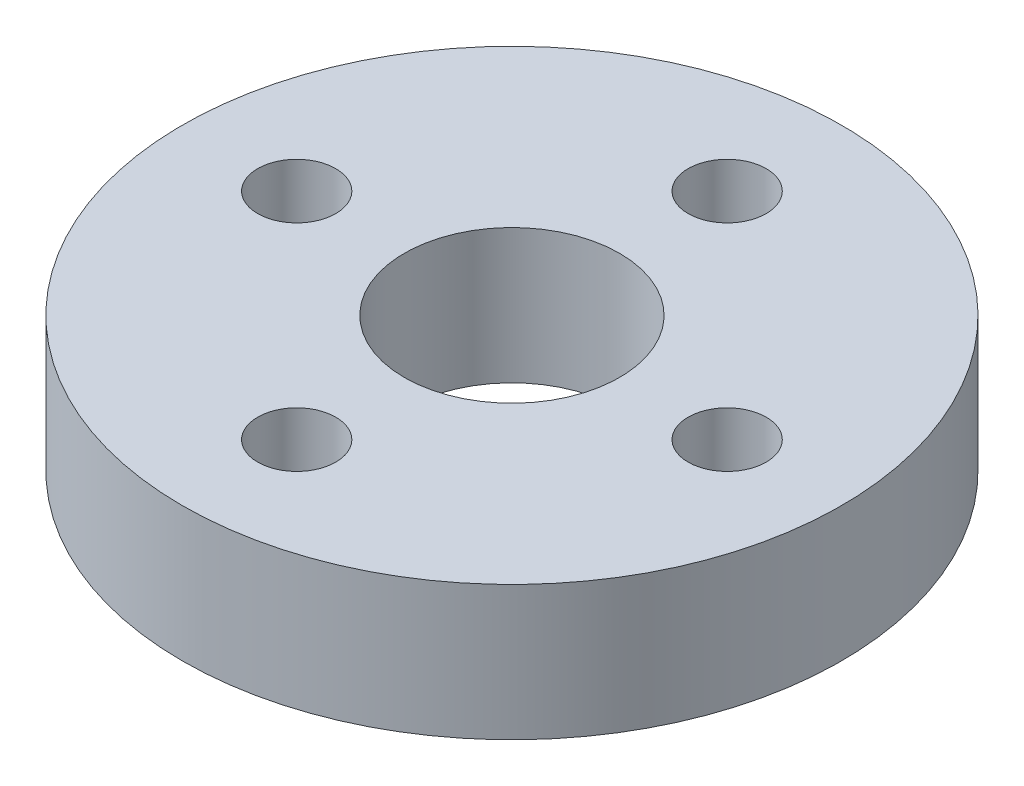
ISO-10303-21;
HEADER;
FILE_DESCRIPTION(('STEP AP214'),'2;1');
FILE_NAME('part.step','',(''),(''),'','','');
FILE_SCHEMA(('AUTOMOTIVE_DESIGN { 1 0 10303 214 1 1 1 1 }'));
ENDSEC;
DATA;
#1=APPLICATION_CONTEXT('core data for automotive mechanical design processes');
#2=APPLICATION_PROTOCOL_DEFINITION('international standard','automotive_design',2000,#1);
#3=PRODUCT_CONTEXT('',#1,'mechanical');
#4=PRODUCT('Part','Part','',(#3));
#5=PRODUCT_RELATED_PRODUCT_CATEGORY('part','',(#4));
#6=PRODUCT_DEFINITION_FORMATION('','',#4);
#7=PRODUCT_DEFINITION_CONTEXT('part definition',#1,'design');
#8=PRODUCT_DEFINITION('design','',#6,#7);
#9=PRODUCT_DEFINITION_SHAPE('','',#8);
#10=(LENGTH_UNIT() NAMED_UNIT(*) SI_UNIT(.MILLI.,.METRE.));
#11=(NAMED_UNIT(*) PLANE_ANGLE_UNIT() SI_UNIT($,.RADIAN.));
#12=(NAMED_UNIT(*) SI_UNIT($,.STERADIAN.) SOLID_ANGLE_UNIT());
#13=UNCERTAINTY_MEASURE_WITH_UNIT(LENGTH_MEASURE(1.E-05),#10,'distance_accuracy_value','');
#14=(GEOMETRIC_REPRESENTATION_CONTEXT(3) GLOBAL_UNCERTAINTY_ASSIGNED_CONTEXT((#13)) GLOBAL_UNIT_ASSIGNED_CONTEXT((#10,
#11,#12)) REPRESENTATION_CONTEXT('',''));
#15=CARTESIAN_POINT('',(0.,0.,0.));
#16=DIRECTION('',(0.,0.,1.));
#17=DIRECTION('',(1.,0.,0.));
#18=AXIS2_PLACEMENT_3D('',#15,#16,#17);
#19=CARTESIAN_POINT('',(0.,5.,0.));
#20=DIRECTION('',(0.,1.,0.));
#21=DIRECTION('',(0.,0.,1.));
#22=AXIS2_PLACEMENT_3D('',#19,#20,#21);
#23=PLANE('',#22);
#24=CARTESIAN_POINT('',(0.,5.,8.));
#25=DIRECTION('',(0.,1.,0.));
#26=DIRECTION('',(0.,0.,1.));
#27=AXIS2_PLACEMENT_3D('',#24,#25,#26);
#28=CIRCLE('',#27,1.45);
#29=CARTESIAN_POINT('',(0.,5.,9.45));
#30=VERTEX_POINT('',#29);
#31=EDGE_CURVE('E61',#30,#30,#28,.T.);
#32=ORIENTED_EDGE('',*,*,#31,.F.);
#33=EDGE_LOOP('',(#32));
#34=FACE_BOUND('',#33,.T.);
#35=CARTESIAN_POINT('',(0.,5.,-8.));
#36=DIRECTION('',(0.,1.,0.));
#37=DIRECTION('',(0.,0.,1.));
#38=AXIS2_PLACEMENT_3D('',#35,#36,#37);
#39=CIRCLE('',#38,1.45);
#40=CARTESIAN_POINT('',(0.,5.,-6.55));
#41=VERTEX_POINT('',#40);
#42=EDGE_CURVE('E49',#41,#41,#39,.T.);
#43=ORIENTED_EDGE('',*,*,#42,.F.);
#44=EDGE_LOOP('',(#43));
#45=FACE_BOUND('',#44,.T.);
#46=CARTESIAN_POINT('',(0.,5.,0.));
#47=DIRECTION('',(0.,1.,0.));
#48=DIRECTION('',(0.,0.,1.));
#49=AXIS2_PLACEMENT_3D('',#46,#47,#48);
#50=CIRCLE('',#49,12.25);
#51=CARTESIAN_POINT('',(0.,5.,12.25));
#52=VERTEX_POINT('',#51);
#53=EDGE_CURVE('E10',#52,#52,#50,.T.);
#54=ORIENTED_EDGE('',*,*,#53,.T.);
#55=EDGE_LOOP('',(#54));
#56=FACE_BOUND('',#55,.T.);
#57=CARTESIAN_POINT('',(0.,5.,0.));
#58=DIRECTION('',(0.,1.,0.));
#59=DIRECTION('',(0.,0.,1.));
#60=AXIS2_PLACEMENT_3D('',#57,#58,#59);
#61=CIRCLE('',#60,4.);
#62=CARTESIAN_POINT('',(0.,5.,4.));
#63=VERTEX_POINT('',#62);
#64=EDGE_CURVE('E44',#63,#63,#61,.T.);
#65=ORIENTED_EDGE('',*,*,#64,.F.);
#66=EDGE_LOOP('',(#65));
#67=FACE_BOUND('',#66,.T.);
#68=CARTESIAN_POINT('',(8.,5.,0.));
#69=DIRECTION('',(0.,1.,0.));
#70=DIRECTION('',(0.,0.,1.));
#71=AXIS2_PLACEMENT_3D('',#68,#69,#70);
#72=CIRCLE('',#71,1.45);
#73=CARTESIAN_POINT('',(8.,5.,1.45));
#74=VERTEX_POINT('',#73);
#75=EDGE_CURVE('E55',#74,#74,#72,.T.);
#76=ORIENTED_EDGE('',*,*,#75,.F.);
#77=EDGE_LOOP('',(#76));
#78=FACE_BOUND('',#77,.T.);
#79=CARTESIAN_POINT('',(-8.,5.,0.));
#80=DIRECTION('',(0.,1.,0.));
#81=DIRECTION('',(0.,0.,1.));
#82=AXIS2_PLACEMENT_3D('',#79,#80,#81);
#83=CIRCLE('',#82,1.45);
#84=CARTESIAN_POINT('',(-8.,5.,1.45));
#85=VERTEX_POINT('',#84);
#86=EDGE_CURVE('E67',#85,#85,#83,.T.);
#87=ORIENTED_EDGE('',*,*,#86,.F.);
#88=EDGE_LOOP('',(#87));
#89=FACE_BOUND('',#88,.T.);
#90=ADVANCED_FACE('F33',(#34,#45,#56,#67,#78,#89),#23,.T.);
#91=CARTESIAN_POINT('',(0.,0.,0.));
#92=DIRECTION('',(0.,1.,0.));
#93=DIRECTION('',(0.,0.,1.));
#94=AXIS2_PLACEMENT_3D('',#91,#92,#93);
#95=PLANE('',#94);
#96=CARTESIAN_POINT('',(0.,0.,0.));
#97=DIRECTION('',(0.,1.,0.));
#98=DIRECTION('',(0.,0.,1.));
#99=AXIS2_PLACEMENT_3D('',#96,#97,#98);
#100=CIRCLE('',#99,12.25);
#101=CARTESIAN_POINT('',(0.,0.,12.25));
#102=VERTEX_POINT('',#101);
#103=EDGE_CURVE('E37',#102,#102,#100,.T.);
#104=ORIENTED_EDGE('',*,*,#103,.F.);
#105=EDGE_LOOP('',(#104));
#106=FACE_BOUND('',#105,.T.);
#107=CARTESIAN_POINT('',(0.,0.,0.));
#108=DIRECTION('',(0.,1.,0.));
#109=DIRECTION('',(0.,0.,1.));
#110=AXIS2_PLACEMENT_3D('',#107,#108,#109);
#111=CIRCLE('',#110,4.);
#112=CARTESIAN_POINT('',(0.,0.,4.));
#113=VERTEX_POINT('',#112);
#114=EDGE_CURVE('E46',#113,#113,#111,.T.);
#115=ORIENTED_EDGE('',*,*,#114,.T.);
#116=EDGE_LOOP('',(#115));
#117=FACE_BOUND('',#116,.T.);
#118=CARTESIAN_POINT('',(0.,0.,-8.));
#119=DIRECTION('',(0.,1.,0.));
#120=DIRECTION('',(0.,0.,1.));
#121=AXIS2_PLACEMENT_3D('',#118,#119,#120);
#122=CIRCLE('',#121,1.45);
#123=CARTESIAN_POINT('',(0.,0.,-6.55));
#124=VERTEX_POINT('',#123);
#125=EDGE_CURVE('E52',#124,#124,#122,.T.);
#126=ORIENTED_EDGE('',*,*,#125,.T.);
#127=EDGE_LOOP('',(#126));
#128=FACE_BOUND('',#127,.T.);
#129=CARTESIAN_POINT('',(8.,0.,0.));
#130=DIRECTION('',(0.,1.,0.));
#131=DIRECTION('',(0.,0.,1.));
#132=AXIS2_PLACEMENT_3D('',#129,#130,#131);
#133=CIRCLE('',#132,1.45);
#134=CARTESIAN_POINT('',(8.,0.,1.45));
#135=VERTEX_POINT('',#134);
#136=EDGE_CURVE('E58',#135,#135,#133,.T.);
#137=ORIENTED_EDGE('',*,*,#136,.T.);
#138=EDGE_LOOP('',(#137));
#139=FACE_BOUND('',#138,.T.);
#140=CARTESIAN_POINT('',(0.,0.,8.));
#141=DIRECTION('',(0.,1.,0.));
#142=DIRECTION('',(0.,0.,1.));
#143=AXIS2_PLACEMENT_3D('',#140,#141,#142);
#144=CIRCLE('',#143,1.45);
#145=CARTESIAN_POINT('',(0.,0.,9.45));
#146=VERTEX_POINT('',#145);
#147=EDGE_CURVE('E64',#146,#146,#144,.T.);
#148=ORIENTED_EDGE('',*,*,#147,.T.);
#149=EDGE_LOOP('',(#148));
#150=FACE_BOUND('',#149,.T.);
#151=CARTESIAN_POINT('',(-8.,0.,0.));
#152=DIRECTION('',(0.,1.,0.));
#153=DIRECTION('',(0.,0.,1.));
#154=AXIS2_PLACEMENT_3D('',#151,#152,#153);
#155=CIRCLE('',#154,1.45);
#156=CARTESIAN_POINT('',(-8.,0.,1.45));
#157=VERTEX_POINT('',#156);
#158=EDGE_CURVE('E70',#157,#157,#155,.T.);
#159=ORIENTED_EDGE('',*,*,#158,.T.);
#160=EDGE_LOOP('',(#159));
#161=FACE_BOUND('',#160,.T.);
#162=ADVANCED_FACE('F80',(#106,#117,#128,#139,#150,#161),#95,.F.);
#163=CARTESIAN_POINT('',(0.,5.,0.));
#164=DIRECTION('',(0.,-1.,0.));
#165=DIRECTION('',(0.,0.,-1.));
#166=AXIS2_PLACEMENT_3D('',#163,#164,#165);
#167=CYLINDRICAL_SURFACE('',#166,12.25);
#168=ORIENTED_EDGE('',*,*,#53,.F.);
#169=EDGE_LOOP('',(#168));
#170=FACE_BOUND('',#169,.T.);
#171=ORIENTED_EDGE('',*,*,#103,.T.);
#172=EDGE_LOOP('',(#171));
#173=FACE_BOUND('',#172,.T.);
#174=ADVANCED_FACE('F35',(#170,#173),#167,.T.);
#175=CARTESIAN_POINT('',(0.,5.,0.));
#176=DIRECTION('',(0.,-1.,0.));
#177=DIRECTION('',(0.,0.,-1.));
#178=AXIS2_PLACEMENT_3D('',#175,#176,#177);
#179=CYLINDRICAL_SURFACE('',#178,4.);
#180=ORIENTED_EDGE('',*,*,#64,.T.);
#181=EDGE_LOOP('',(#180));
#182=FACE_BOUND('',#181,.T.);
#183=ORIENTED_EDGE('',*,*,#114,.F.);
#184=EDGE_LOOP('',(#183));
#185=FACE_BOUND('',#184,.T.);
#186=ADVANCED_FACE('F90',(#182,#185),#179,.F.);
#187=CARTESIAN_POINT('',(0.,5.,-8.));
#188=DIRECTION('',(0.,-1.,0.));
#189=DIRECTION('',(0.,0.,-1.));
#190=AXIS2_PLACEMENT_3D('',#187,#188,#189);
#191=CYLINDRICAL_SURFACE('',#190,1.45);
#192=ORIENTED_EDGE('',*,*,#42,.T.);
#193=EDGE_LOOP('',(#192));
#194=FACE_BOUND('',#193,.T.);
#195=ORIENTED_EDGE('',*,*,#125,.F.);
#196=EDGE_LOOP('',(#195));
#197=FACE_BOUND('',#196,.T.);
#198=ADVANCED_FACE('F93',(#194,#197),#191,.F.);
#199=CARTESIAN_POINT('',(8.,5.,0.));
#200=DIRECTION('',(0.,-1.,0.));
#201=DIRECTION('',(0.,0.,-1.));
#202=AXIS2_PLACEMENT_3D('',#199,#200,#201);
#203=CYLINDRICAL_SURFACE('',#202,1.45);
#204=ORIENTED_EDGE('',*,*,#75,.T.);
#205=EDGE_LOOP('',(#204));
#206=FACE_BOUND('',#205,.T.);
#207=ORIENTED_EDGE('',*,*,#136,.F.);
#208=EDGE_LOOP('',(#207));
#209=FACE_BOUND('',#208,.T.);
#210=ADVANCED_FACE('F97',(#206,#209),#203,.F.);
#211=CARTESIAN_POINT('',(0.,5.,8.));
#212=DIRECTION('',(0.,-1.,0.));
#213=DIRECTION('',(0.,0.,-1.));
#214=AXIS2_PLACEMENT_3D('',#211,#212,#213);
#215=CYLINDRICAL_SURFACE('',#214,1.45);
#216=ORIENTED_EDGE('',*,*,#31,.T.);
#217=EDGE_LOOP('',(#216));
#218=FACE_BOUND('',#217,.T.);
#219=ORIENTED_EDGE('',*,*,#147,.F.);
#220=EDGE_LOOP('',(#219));
#221=FACE_BOUND('',#220,.T.);
#222=ADVANCED_FACE('F101',(#218,#221),#215,.F.);
#223=CARTESIAN_POINT('',(-8.,5.,0.));
#224=DIRECTION('',(0.,-1.,0.));
#225=DIRECTION('',(0.,0.,-1.));
#226=AXIS2_PLACEMENT_3D('',#223,#224,#225);
#227=CYLINDRICAL_SURFACE('',#226,1.45);
#228=ORIENTED_EDGE('',*,*,#86,.T.);
#229=EDGE_LOOP('',(#228));
#230=FACE_BOUND('',#229,.T.);
#231=ORIENTED_EDGE('',*,*,#158,.F.);
#232=EDGE_LOOP('',(#231));
#233=FACE_BOUND('',#232,.T.);
#234=ADVANCED_FACE('F76',(#230,#233),#227,.F.);
#235=CLOSED_SHELL('',(#90,#162,#174,#186,#198,#210,#222,#234));
#236=MANIFOLD_SOLID_BREP('B2',#235);
#237=ADVANCED_BREP_SHAPE_REPRESENTATION('',(#18,#236),#14);
#238=SHAPE_DEFINITION_REPRESENTATION(#9,#237);
ENDSEC;
END-ISO-10303-21;
